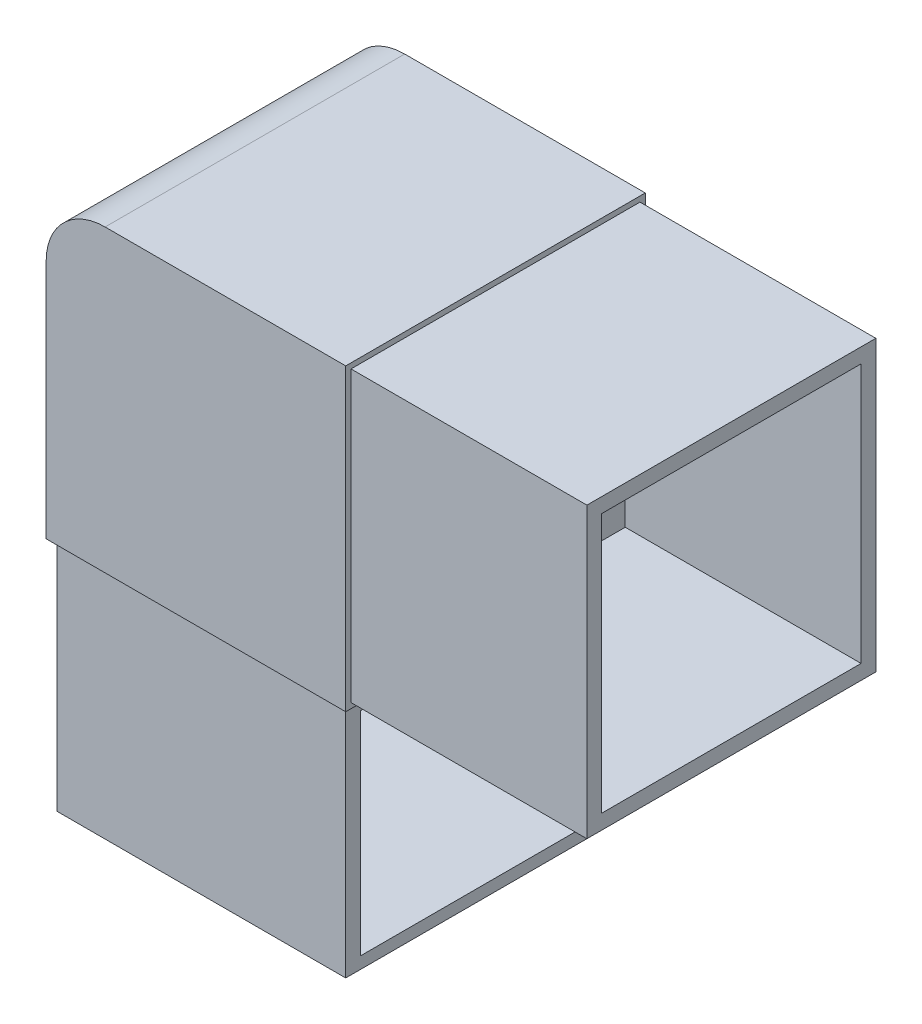
ISO-10303-21;
HEADER;
FILE_DESCRIPTION(('STEP AP214'),'2;1');
FILE_NAME('part.step','',(''),(''),'','','');
FILE_SCHEMA(('AUTOMOTIVE_DESIGN { 1 0 10303 214 1 1 1 1 }'));
ENDSEC;
DATA;
#1=APPLICATION_CONTEXT('core data for automotive mechanical design processes');
#2=APPLICATION_PROTOCOL_DEFINITION('international standard','automotive_design',2000,#1);
#3=PRODUCT_CONTEXT('',#1,'mechanical');
#4=PRODUCT('Part','Part','',(#3));
#5=PRODUCT_RELATED_PRODUCT_CATEGORY('part','',(#4));
#6=PRODUCT_DEFINITION_FORMATION('','',#4);
#7=PRODUCT_DEFINITION_CONTEXT('part definition',#1,'design');
#8=PRODUCT_DEFINITION('design','',#6,#7);
#9=PRODUCT_DEFINITION_SHAPE('','',#8);
#10=(LENGTH_UNIT() NAMED_UNIT(*) SI_UNIT(.MILLI.,.METRE.));
#11=(NAMED_UNIT(*) PLANE_ANGLE_UNIT() SI_UNIT($,.RADIAN.));
#12=(NAMED_UNIT(*) SI_UNIT($,.STERADIAN.) SOLID_ANGLE_UNIT());
#13=UNCERTAINTY_MEASURE_WITH_UNIT(LENGTH_MEASURE(1.E-05),#10,'distance_accuracy_value','');
#14=(GEOMETRIC_REPRESENTATION_CONTEXT(3) GLOBAL_UNCERTAINTY_ASSIGNED_CONTEXT((#13)) GLOBAL_UNIT_ASSIGNED_CONTEXT((#10,
#11,#12)) REPRESENTATION_CONTEXT('',''));
#15=CARTESIAN_POINT('',(0.,0.,0.));
#16=DIRECTION('',(0.,0.,1.));
#17=DIRECTION('',(1.,0.,0.));
#18=AXIS2_PLACEMENT_3D('',#15,#16,#17);
#19=CARTESIAN_POINT('',(0.,0.,0.));
#20=DIRECTION('',(0.,1.,0.));
#21=DIRECTION('',(0.,0.,1.));
#22=AXIS2_PLACEMENT_3D('',#19,#20,#21);
#23=PLANE('',#22);
#24=DIRECTION('',(0.,0.,-1.));
#25=VECTOR('',#24,1.);
#26=CARTESIAN_POINT('',(12.7,0.,-12.7));
#27=LINE('',#26,#25);
#28=CARTESIAN_POINT('',(12.7,0.,12.7));
#29=VERTEX_POINT('',#28);
#30=CARTESIAN_POINT('',(12.7,0.,-12.7));
#31=VERTEX_POINT('',#30);
#32=EDGE_CURVE('E365',#29,#31,#27,.T.);
#33=ORIENTED_EDGE('',*,*,#32,.F.);
#34=DIRECTION('',(1.,0.,0.));
#35=VECTOR('',#34,1.);
#36=CARTESIAN_POINT('',(-12.7,0.,12.7));
#37=LINE('',#36,#35);
#38=CARTESIAN_POINT('',(-12.7,0.,12.7));
#39=VERTEX_POINT('',#38);
#40=EDGE_CURVE('E371',#39,#29,#37,.T.);
#41=ORIENTED_EDGE('',*,*,#40,.F.);
#42=DIRECTION('',(0.,0.,1.));
#43=VECTOR('',#42,1.);
#44=CARTESIAN_POINT('',(-12.7,0.,-12.7));
#45=LINE('',#44,#43);
#46=CARTESIAN_POINT('',(-12.7,0.,-12.7));
#47=VERTEX_POINT('',#46);
#48=EDGE_CURVE('E386',#47,#39,#45,.T.);
#49=ORIENTED_EDGE('',*,*,#48,.F.);
#50=DIRECTION('',(-1.,0.,0.));
#51=VECTOR('',#50,1.);
#52=CARTESIAN_POINT('',(-12.7,0.,-12.7));
#53=LINE('',#52,#51);
#54=EDGE_CURVE('E382',#31,#47,#53,.T.);
#55=ORIENTED_EDGE('',*,*,#54,.F.);
#56=EDGE_LOOP('',(#33,#41,#49,#55));
#57=FACE_BOUND('',#56,.T.);
#58=DIRECTION('',(0.,0.,1.));
#59=VECTOR('',#58,1.);
#60=CARTESIAN_POINT('',(12.25,0.,12.25));
#61=LINE('',#60,#59);
#62=CARTESIAN_POINT('',(12.25,0.,-12.25));
#63=VERTEX_POINT('',#62);
#64=CARTESIAN_POINT('',(12.25,0.,12.25));
#65=VERTEX_POINT('',#64);
#66=EDGE_CURVE('E67',#63,#65,#61,.T.);
#67=ORIENTED_EDGE('',*,*,#66,.F.);
#68=DIRECTION('',(1.,0.,0.));
#69=VECTOR('',#68,1.);
#70=CARTESIAN_POINT('',(-12.25,0.,-12.25));
#71=LINE('',#70,#69);
#72=CARTESIAN_POINT('',(-12.25,0.,-12.25));
#73=VERTEX_POINT('',#72);
#74=EDGE_CURVE('E241',#73,#63,#71,.T.);
#75=ORIENTED_EDGE('',*,*,#74,.F.);
#76=DIRECTION('',(0.,0.,-1.));
#77=VECTOR('',#76,1.);
#78=CARTESIAN_POINT('',(-12.25,0.,12.25));
#79=LINE('',#78,#77);
#80=CARTESIAN_POINT('',(-12.25,0.,12.25));
#81=VERTEX_POINT('',#80);
#82=EDGE_CURVE('E257',#81,#73,#79,.T.);
#83=ORIENTED_EDGE('',*,*,#82,.F.);
#84=DIRECTION('',(-1.,0.,0.));
#85=VECTOR('',#84,1.);
#86=CARTESIAN_POINT('',(-12.25,0.,12.25));
#87=LINE('',#86,#85);
#88=EDGE_CURVE('E253',#65,#81,#87,.T.);
#89=ORIENTED_EDGE('',*,*,#88,.F.);
#90=EDGE_LOOP('',(#67,#75,#83,#89));
#91=FACE_BOUND('',#90,.T.);
#92=ADVANCED_FACE('F43',(#57,#91),#23,.F.);
#93=CARTESIAN_POINT('',(12.7,25.4,-12.7));
#94=DIRECTION('',(-1.,0.,0.));
#95=DIRECTION('',(0.,0.,1.));
#96=AXIS2_PLACEMENT_3D('',#93,#94,#95);
#97=PLANE('',#96);
#98=DIRECTION('',(0.,0.,-1.));
#99=VECTOR('',#98,1.);
#100=CARTESIAN_POINT('',(12.7,24.95,0.));
#101=LINE('',#100,#99);
#102=CARTESIAN_POINT('',(12.7,24.95,12.25));
#103=VERTEX_POINT('',#102);
#104=CARTESIAN_POINT('',(12.7,24.95,-12.25));
#105=VERTEX_POINT('',#104);
#106=EDGE_CURVE('E342',#103,#105,#101,.T.);
#107=ORIENTED_EDGE('',*,*,#106,.T.);
#108=DIRECTION('',(0.,-1.,0.));
#109=VECTOR('',#108,1.);
#110=CARTESIAN_POINT('',(12.7,0.,-12.25));
#111=LINE('',#110,#109);
#112=CARTESIAN_POINT('',(12.7,0.449999999999997,-12.25));
#113=VERTEX_POINT('',#112);
#114=EDGE_CURVE('E313',#105,#113,#111,.T.);
#115=ORIENTED_EDGE('',*,*,#114,.T.);
#116=DIRECTION('',(0.,0.,-1.));
#117=VECTOR('',#116,1.);
#118=CARTESIAN_POINT('',(12.7,0.449999999999997,0.));
#119=LINE('',#118,#117);
#120=CARTESIAN_POINT('',(12.7,0.449999999999997,12.25));
#121=VERTEX_POINT('',#120);
#122=EDGE_CURVE('E328',#121,#113,#119,.T.);
#123=ORIENTED_EDGE('',*,*,#122,.F.);
#124=DIRECTION('',(0.,-1.,0.));
#125=VECTOR('',#124,1.);
#126=CARTESIAN_POINT('',(12.7,0.,12.25));
#127=LINE('',#126,#125);
#128=EDGE_CURVE('E346',#103,#121,#127,.T.);
#129=ORIENTED_EDGE('',*,*,#128,.F.);
#130=EDGE_LOOP('',(#107,#115,#123,#129));
#131=FACE_BOUND('',#130,.T.);
#132=ORIENTED_EDGE('',*,*,#32,.T.);
#133=DIRECTION('',(0.,-1.,0.));
#134=VECTOR('',#133,1.);
#135=CARTESIAN_POINT('',(12.7,25.4,-12.7));
#136=LINE('',#135,#134);
#137=CARTESIAN_POINT('',(12.7,25.4,-12.7));
#138=VERTEX_POINT('',#137);
#139=EDGE_CURVE('E401',#138,#31,#136,.T.);
#140=ORIENTED_EDGE('',*,*,#139,.F.);
#141=DIRECTION('',(0.,0.,-1.));
#142=VECTOR('',#141,1.);
#143=CARTESIAN_POINT('',(12.7,25.4,-12.7));
#144=LINE('',#143,#142);
#145=CARTESIAN_POINT('',(12.7,25.4,12.7));
#146=VERTEX_POINT('',#145);
#147=EDGE_CURVE('E366',#146,#138,#144,.T.);
#148=ORIENTED_EDGE('',*,*,#147,.F.);
#149=DIRECTION('',(0.,-1.,0.));
#150=VECTOR('',#149,1.);
#151=CARTESIAN_POINT('',(12.7,25.4,12.7));
#152=LINE('',#151,#150);
#153=EDGE_CURVE('E378',#146,#29,#152,.T.);
#154=ORIENTED_EDGE('',*,*,#153,.T.);
#155=EDGE_LOOP('',(#132,#140,#148,#154));
#156=FACE_BOUND('',#155,.T.);
#157=ADVANCED_FACE('F434',(#131,#156),#97,.F.);
#158=CARTESIAN_POINT('',(-12.7,25.4,-12.7));
#159=DIRECTION('',(0.,0.,1.));
#160=DIRECTION('',(1.,0.,0.));
#161=AXIS2_PLACEMENT_3D('',#158,#159,#160);
#162=PLANE('',#161);
#163=DIRECTION('',(0.,-1.,0.));
#164=VECTOR('',#163,1.);
#165=CARTESIAN_POINT('',(-12.7,25.4,-12.7));
#166=LINE('',#165,#164);
#167=CARTESIAN_POINT('',(-12.7,20.4,-12.7));
#168=VERTEX_POINT('',#167);
#169=EDGE_CURVE('E398',#168,#47,#166,.T.);
#170=ORIENTED_EDGE('',*,*,#169,.F.);
#171=CARTESIAN_POINT('',(-7.7,20.4,-12.7));
#172=DIRECTION('',(0.,0.,1.));
#173=DIRECTION('',(1.,0.,0.));
#174=AXIS2_PLACEMENT_3D('',#171,#172,#173);
#175=CIRCLE('',#174,5.);
#176=CARTESIAN_POINT('',(-7.7,25.4,-12.7));
#177=VERTEX_POINT('',#176);
#178=EDGE_CURVE('E11',#168,#177,#175,.F.);
#179=ORIENTED_EDGE('',*,*,#178,.T.);
#180=DIRECTION('',(-1.,0.,0.));
#181=VECTOR('',#180,1.);
#182=CARTESIAN_POINT('',(-12.7,25.4,-12.7));
#183=LINE('',#182,#181);
#184=EDGE_CURVE('E370',#138,#177,#183,.T.);
#185=ORIENTED_EDGE('',*,*,#184,.F.);
#186=ORIENTED_EDGE('',*,*,#139,.T.);
#187=ORIENTED_EDGE('',*,*,#54,.T.);
#188=EDGE_LOOP('',(#170,#179,#185,#186,#187));
#189=FACE_BOUND('',#188,.T.);
#190=ADVANCED_FACE('F420',(#189),#162,.F.);
#191=CARTESIAN_POINT('',(-12.7,25.4,-12.7));
#192=DIRECTION('',(1.,0.,0.));
#193=DIRECTION('',(0.,0.,-1.));
#194=AXIS2_PLACEMENT_3D('',#191,#192,#193);
#195=PLANE('',#194);
#196=DIRECTION('',(0.,-1.,0.));
#197=VECTOR('',#196,1.);
#198=CARTESIAN_POINT('',(-12.7,25.4,12.7));
#199=LINE('',#198,#197);
#200=CARTESIAN_POINT('',(-12.7,20.4,12.7));
#201=VERTEX_POINT('',#200);
#202=EDGE_CURVE('E395',#201,#39,#199,.T.);
#203=ORIENTED_EDGE('',*,*,#202,.F.);
#204=DIRECTION('',(0.,0.,1.));
#205=VECTOR('',#204,1.);
#206=CARTESIAN_POINT('',(-12.7,20.4,-12.7));
#207=LINE('',#206,#205);
#208=EDGE_CURVE('E52',#201,#168,#207,.F.);
#209=ORIENTED_EDGE('',*,*,#208,.T.);
#210=ORIENTED_EDGE('',*,*,#169,.T.);
#211=ORIENTED_EDGE('',*,*,#48,.T.);
#212=EDGE_LOOP('',(#203,#209,#210,#211));
#213=FACE_BOUND('',#212,.T.);
#214=ADVANCED_FACE('F416',(#213),#195,.F.);
#215=CARTESIAN_POINT('',(-12.7,25.4,12.7));
#216=DIRECTION('',(0.,0.,-1.));
#217=DIRECTION('',(-1.,0.,0.));
#218=AXIS2_PLACEMENT_3D('',#215,#216,#217);
#219=PLANE('',#218);
#220=DIRECTION('',(1.,0.,0.));
#221=VECTOR('',#220,1.);
#222=CARTESIAN_POINT('',(-12.7,25.4,12.7));
#223=LINE('',#222,#221);
#224=CARTESIAN_POINT('',(-7.7,25.4,12.7));
#225=VERTEX_POINT('',#224);
#226=EDGE_CURVE('E375',#225,#146,#223,.T.);
#227=ORIENTED_EDGE('',*,*,#226,.F.);
#228=CARTESIAN_POINT('',(-7.7,20.4,12.7));
#229=DIRECTION('',(0.,0.,-1.));
#230=DIRECTION('',(-1.,0.,0.));
#231=AXIS2_PLACEMENT_3D('',#228,#229,#230);
#232=CIRCLE('',#231,5.);
#233=EDGE_CURVE('E409',#225,#201,#232,.F.);
#234=ORIENTED_EDGE('',*,*,#233,.T.);
#235=ORIENTED_EDGE('',*,*,#202,.T.);
#236=ORIENTED_EDGE('',*,*,#40,.T.);
#237=ORIENTED_EDGE('',*,*,#153,.F.);
#238=EDGE_LOOP('',(#227,#234,#235,#236,#237));
#239=FACE_BOUND('',#238,.T.);
#240=ADVANCED_FACE('F428',(#239),#219,.F.);
#241=CARTESIAN_POINT('',(0.,25.4,0.));
#242=DIRECTION('',(0.,1.,0.));
#243=DIRECTION('',(0.,0.,1.));
#244=AXIS2_PLACEMENT_3D('',#241,#242,#243);
#245=PLANE('',#244);
#246=ORIENTED_EDGE('',*,*,#184,.T.);
#247=DIRECTION('',(0.,0.,1.));
#248=VECTOR('',#247,1.);
#249=CARTESIAN_POINT('',(-7.7,25.4,12.7));
#250=LINE('',#249,#248);
#251=EDGE_CURVE('E405',#177,#225,#250,.T.);
#252=ORIENTED_EDGE('',*,*,#251,.T.);
#253=ORIENTED_EDGE('',*,*,#226,.T.);
#254=ORIENTED_EDGE('',*,*,#147,.T.);
#255=EDGE_LOOP('',(#246,#252,#253,#254));
#256=FACE_BOUND('',#255,.T.);
#257=ADVANCED_FACE('F425',(#256),#245,.T.);
#258=CARTESIAN_POINT('',(-7.7,20.4,0.));
#259=DIRECTION('',(0.,0.,-1.));
#260=DIRECTION('',(-1.,0.,0.));
#261=AXIS2_PLACEMENT_3D('',#258,#259,#260);
#262=CYLINDRICAL_SURFACE('',#261,5.);
#263=ORIENTED_EDGE('',*,*,#178,.F.);
#264=ORIENTED_EDGE('',*,*,#208,.F.);
#265=ORIENTED_EDGE('',*,*,#233,.F.);
#266=ORIENTED_EDGE('',*,*,#251,.F.);
#267=EDGE_LOOP('',(#263,#264,#265,#266));
#268=FACE_BOUND('',#267,.T.);
#269=ADVANCED_FACE('F45',(#268),#262,.T.);
#270=CARTESIAN_POINT('',(32.7,0.,-12.25));
#271=DIRECTION('',(0.,0.,-1.));
#272=DIRECTION('',(0.,1.,0.));
#273=AXIS2_PLACEMENT_3D('',#270,#271,#272);
#274=PLANE('',#273);
#275=ORIENTED_EDGE('',*,*,#114,.F.);
#276=DIRECTION('',(-1.,0.,0.));
#277=VECTOR('',#276,1.);
#278=CARTESIAN_POINT('',(32.7,24.95,-12.25));
#279=LINE('',#278,#277);
#280=CARTESIAN_POINT('',(32.7,24.95,-12.25));
#281=VERTEX_POINT('',#280);
#282=EDGE_CURVE('E361',#281,#105,#279,.T.);
#283=ORIENTED_EDGE('',*,*,#282,.F.);
#284=DIRECTION('',(0.,-1.,0.));
#285=VECTOR('',#284,1.);
#286=CARTESIAN_POINT('',(32.7,0.,-12.25));
#287=LINE('',#286,#285);
#288=CARTESIAN_POINT('',(32.7,0.449999999999997,-12.25));
#289=VERTEX_POINT('',#288);
#290=EDGE_CURVE('E323',#281,#289,#287,.T.);
#291=ORIENTED_EDGE('',*,*,#290,.T.);
#292=DIRECTION('',(-1.,0.,0.));
#293=VECTOR('',#292,1.);
#294=CARTESIAN_POINT('',(32.7,0.449999999999997,-12.25));
#295=LINE('',#294,#293);
#296=EDGE_CURVE('E338',#289,#113,#295,.T.);
#297=ORIENTED_EDGE('',*,*,#296,.T.);
#298=EDGE_LOOP('',(#275,#283,#291,#297));
#299=FACE_BOUND('',#298,.T.);
#300=ADVANCED_FACE('F473',(#299),#274,.T.);
#301=CARTESIAN_POINT('',(32.7,24.95,0.));
#302=DIRECTION('',(0.,1.,0.));
#303=DIRECTION('',(0.,0.,1.));
#304=AXIS2_PLACEMENT_3D('',#301,#302,#303);
#305=PLANE('',#304);
#306=ORIENTED_EDGE('',*,*,#106,.F.);
#307=DIRECTION('',(-1.,0.,0.));
#308=VECTOR('',#307,1.);
#309=CARTESIAN_POINT('',(32.7,24.95,12.25));
#310=LINE('',#309,#308);
#311=CARTESIAN_POINT('',(32.7,24.95,12.25));
#312=VERTEX_POINT('',#311);
#313=EDGE_CURVE('E358',#312,#103,#310,.T.);
#314=ORIENTED_EDGE('',*,*,#313,.F.);
#315=DIRECTION('',(0.,0.,-1.));
#316=VECTOR('',#315,1.);
#317=CARTESIAN_POINT('',(32.7,24.95,0.));
#318=LINE('',#317,#316);
#319=EDGE_CURVE('E327',#312,#281,#318,.T.);
#320=ORIENTED_EDGE('',*,*,#319,.T.);
#321=ORIENTED_EDGE('',*,*,#282,.T.);
#322=EDGE_LOOP('',(#306,#314,#320,#321));
#323=FACE_BOUND('',#322,.T.);
#324=ADVANCED_FACE('F479',(#323),#305,.T.);
#325=CARTESIAN_POINT('',(32.7,0.,12.25));
#326=DIRECTION('',(0.,0.,-1.));
#327=DIRECTION('',(0.,1.,0.));
#328=AXIS2_PLACEMENT_3D('',#325,#326,#327);
#329=PLANE('',#328);
#330=ORIENTED_EDGE('',*,*,#128,.T.);
#331=DIRECTION('',(-1.,0.,0.));
#332=VECTOR('',#331,1.);
#333=CARTESIAN_POINT('',(32.7,0.449999999999997,12.25));
#334=LINE('',#333,#332);
#335=CARTESIAN_POINT('',(32.7,0.449999999999997,12.25));
#336=VERTEX_POINT('',#335);
#337=EDGE_CURVE('E354',#336,#121,#334,.T.);
#338=ORIENTED_EDGE('',*,*,#337,.F.);
#339=DIRECTION('',(0.,-1.,0.));
#340=VECTOR('',#339,1.);
#341=CARTESIAN_POINT('',(32.7,0.,12.25));
#342=LINE('',#341,#340);
#343=EDGE_CURVE('E332',#312,#336,#342,.T.);
#344=ORIENTED_EDGE('',*,*,#343,.F.);
#345=ORIENTED_EDGE('',*,*,#313,.T.);
#346=EDGE_LOOP('',(#330,#338,#344,#345));
#347=FACE_BOUND('',#346,.T.);
#348=ADVANCED_FACE('F486',(#347),#329,.F.);
#349=CARTESIAN_POINT('',(32.7,0.449999999999997,0.));
#350=DIRECTION('',(0.,1.,0.));
#351=DIRECTION('',(0.,0.,1.));
#352=AXIS2_PLACEMENT_3D('',#349,#350,#351);
#353=PLANE('',#352);
#354=ORIENTED_EDGE('',*,*,#122,.T.);
#355=ORIENTED_EDGE('',*,*,#296,.F.);
#356=DIRECTION('',(0.,0.,-1.));
#357=VECTOR('',#356,1.);
#358=CARTESIAN_POINT('',(32.7,0.449999999999997,0.));
#359=LINE('',#358,#357);
#360=EDGE_CURVE('E335',#336,#289,#359,.T.);
#361=ORIENTED_EDGE('',*,*,#360,.F.);
#362=ORIENTED_EDGE('',*,*,#337,.T.);
#363=EDGE_LOOP('',(#354,#355,#361,#362));
#364=FACE_BOUND('',#363,.T.);
#365=ADVANCED_FACE('F494',(#364),#353,.F.);
#366=CARTESIAN_POINT('',(32.7,0.,0.));
#367=DIRECTION('',(1.,0.,0.));
#368=DIRECTION('',(0.,0.,-1.));
#369=AXIS2_PLACEMENT_3D('',#366,#367,#368);
#370=PLANE('',#369);
#371=DIRECTION('',(0.,1.,0.));
#372=VECTOR('',#371,1.);
#373=CARTESIAN_POINT('',(32.7,23.7,-11.));
#374=LINE('',#373,#372);
#375=CARTESIAN_POINT('',(32.7,1.7,-11.));
#376=VERTEX_POINT('',#375);
#377=CARTESIAN_POINT('',(32.7,23.7,-11.));
#378=VERTEX_POINT('',#377);
#379=EDGE_CURVE('E278',#376,#378,#374,.T.);
#380=ORIENTED_EDGE('',*,*,#379,.F.);
#381=DIRECTION('',(0.,0.,-1.));
#382=VECTOR('',#381,1.);
#383=CARTESIAN_POINT('',(32.7,1.7,11.));
#384=LINE('',#383,#382);
#385=CARTESIAN_POINT('',(32.7,1.7,11.));
#386=VERTEX_POINT('',#385);
#387=EDGE_CURVE('E284',#386,#376,#384,.T.);
#388=ORIENTED_EDGE('',*,*,#387,.F.);
#389=DIRECTION('',(0.,-1.,0.));
#390=VECTOR('',#389,1.);
#391=CARTESIAN_POINT('',(32.7,23.7,11.));
#392=LINE('',#391,#390);
#393=CARTESIAN_POINT('',(32.7,23.7,11.));
#394=VERTEX_POINT('',#393);
#395=EDGE_CURVE('E303',#394,#386,#392,.T.);
#396=ORIENTED_EDGE('',*,*,#395,.F.);
#397=DIRECTION('',(0.,0.,1.));
#398=VECTOR('',#397,1.);
#399=CARTESIAN_POINT('',(32.7,23.7,11.));
#400=LINE('',#399,#398);
#401=EDGE_CURVE('E299',#378,#394,#400,.T.);
#402=ORIENTED_EDGE('',*,*,#401,.F.);
#403=EDGE_LOOP('',(#380,#388,#396,#402));
#404=FACE_BOUND('',#403,.T.);
#405=ORIENTED_EDGE('',*,*,#290,.F.);
#406=ORIENTED_EDGE('',*,*,#319,.F.);
#407=ORIENTED_EDGE('',*,*,#343,.T.);
#408=ORIENTED_EDGE('',*,*,#360,.T.);
#409=EDGE_LOOP('',(#405,#406,#407,#408));
#410=FACE_BOUND('',#409,.T.);
#411=ADVANCED_FACE('F502',(#404,#410),#370,.T.);
#412=CARTESIAN_POINT('',(12.7,23.7,-11.));
#413=DIRECTION('',(0.,0.,-1.));
#414=DIRECTION('',(0.,1.,0.));
#415=AXIS2_PLACEMENT_3D('',#412,#413,#414);
#416=PLANE('',#415);
#417=ORIENTED_EDGE('',*,*,#379,.T.);
#418=DIRECTION('',(1.,0.,0.));
#419=VECTOR('',#418,1.);
#420=CARTESIAN_POINT('',(12.7,23.7,-11.));
#421=LINE('',#420,#419);
#422=CARTESIAN_POINT('',(12.7,23.7,-11.));
#423=VERTEX_POINT('',#422);
#424=EDGE_CURVE('E296',#423,#378,#421,.T.);
#425=ORIENTED_EDGE('',*,*,#424,.F.);
#426=DIRECTION('',(0.,1.,0.));
#427=VECTOR('',#426,1.);
#428=CARTESIAN_POINT('',(12.7,23.7,-11.));
#429=LINE('',#428,#427);
#430=CARTESIAN_POINT('',(12.7,1.7,-11.));
#431=VERTEX_POINT('',#430);
#432=EDGE_CURVE('E279',#431,#423,#429,.T.);
#433=ORIENTED_EDGE('',*,*,#432,.F.);
#434=DIRECTION('',(1.,0.,0.));
#435=VECTOR('',#434,1.);
#436=CARTESIAN_POINT('',(12.7,1.7,-11.));
#437=LINE('',#436,#435);
#438=EDGE_CURVE('E310',#431,#376,#437,.T.);
#439=ORIENTED_EDGE('',*,*,#438,.T.);
#440=EDGE_LOOP('',(#417,#425,#433,#439));
#441=FACE_BOUND('',#440,.T.);
#442=ADVANCED_FACE('F510',(#441),#416,.F.);
#443=CARTESIAN_POINT('',(12.7,1.7,11.));
#444=DIRECTION('',(0.,-1.,0.));
#445=DIRECTION('',(0.,0.,-1.));
#446=AXIS2_PLACEMENT_3D('',#443,#444,#445);
#447=PLANE('',#446);
#448=ORIENTED_EDGE('',*,*,#387,.T.);
#449=ORIENTED_EDGE('',*,*,#438,.F.);
#450=DIRECTION('',(0.,0.,-1.));
#451=VECTOR('',#450,1.);
#452=CARTESIAN_POINT('',(12.7,1.7,11.));
#453=LINE('',#452,#451);
#454=CARTESIAN_POINT('',(12.7,1.7,11.));
#455=VERTEX_POINT('',#454);
#456=EDGE_CURVE('E292',#455,#431,#453,.T.);
#457=ORIENTED_EDGE('',*,*,#456,.F.);
#458=DIRECTION('',(1.,0.,0.));
#459=VECTOR('',#458,1.);
#460=CARTESIAN_POINT('',(12.7,1.7,11.));
#461=LINE('',#460,#459);
#462=EDGE_CURVE('E314',#455,#386,#461,.T.);
#463=ORIENTED_EDGE('',*,*,#462,.T.);
#464=EDGE_LOOP('',(#448,#449,#457,#463));
#465=FACE_BOUND('',#464,.T.);
#466=ADVANCED_FACE('F518',(#465),#447,.F.);
#467=CARTESIAN_POINT('',(12.7,23.7,11.));
#468=DIRECTION('',(0.,0.,1.));
#469=DIRECTION('',(0.,-1.,0.));
#470=AXIS2_PLACEMENT_3D('',#467,#468,#469);
#471=PLANE('',#470);
#472=ORIENTED_EDGE('',*,*,#395,.T.);
#473=ORIENTED_EDGE('',*,*,#462,.F.);
#474=DIRECTION('',(0.,-1.,0.));
#475=VECTOR('',#474,1.);
#476=CARTESIAN_POINT('',(12.7,23.7,11.));
#477=LINE('',#476,#475);
#478=CARTESIAN_POINT('',(12.7,23.7,11.));
#479=VERTEX_POINT('',#478);
#480=EDGE_CURVE('E288',#479,#455,#477,.T.);
#481=ORIENTED_EDGE('',*,*,#480,.F.);
#482=DIRECTION('',(1.,0.,0.));
#483=VECTOR('',#482,1.);
#484=CARTESIAN_POINT('',(12.7,23.7,11.));
#485=LINE('',#484,#483);
#486=EDGE_CURVE('E317',#479,#394,#485,.T.);
#487=ORIENTED_EDGE('',*,*,#486,.T.);
#488=EDGE_LOOP('',(#472,#473,#481,#487));
#489=FACE_BOUND('',#488,.T.);
#490=ADVANCED_FACE('F526',(#489),#471,.F.);
#491=CARTESIAN_POINT('',(12.7,23.7,11.));
#492=DIRECTION('',(0.,1.,0.));
#493=DIRECTION('',(0.,0.,1.));
#494=AXIS2_PLACEMENT_3D('',#491,#492,#493);
#495=PLANE('',#494);
#496=ORIENTED_EDGE('',*,*,#401,.T.);
#497=ORIENTED_EDGE('',*,*,#486,.F.);
#498=DIRECTION('',(0.,0.,1.));
#499=VECTOR('',#498,1.);
#500=CARTESIAN_POINT('',(12.7,23.7,11.));
#501=LINE('',#500,#499);
#502=EDGE_CURVE('E283',#423,#479,#501,.T.);
#503=ORIENTED_EDGE('',*,*,#502,.F.);
#504=ORIENTED_EDGE('',*,*,#424,.T.);
#505=EDGE_LOOP('',(#496,#497,#503,#504));
#506=FACE_BOUND('',#505,.T.);
#507=ADVANCED_FACE('F534',(#506),#495,.F.);
#508=CARTESIAN_POINT('',(12.7,0.,0.));
#509=DIRECTION('',(1.,0.,0.));
#510=DIRECTION('',(0.,0.,-1.));
#511=AXIS2_PLACEMENT_3D('',#508,#509,#510);
#512=PLANE('',#511);
#513=ORIENTED_EDGE('',*,*,#432,.T.);
#514=ORIENTED_EDGE('',*,*,#502,.T.);
#515=ORIENTED_EDGE('',*,*,#480,.T.);
#516=ORIENTED_EDGE('',*,*,#456,.T.);
#517=EDGE_LOOP('',(#513,#514,#515,#516));
#518=FACE_BOUND('',#517,.T.);
#519=ADVANCED_FACE('F542',(#518),#512,.T.);
#520=CARTESIAN_POINT('',(12.25,-20.,12.25));
#521=DIRECTION('',(-1.,0.,0.));
#522=DIRECTION('',(0.,0.,1.));
#523=AXIS2_PLACEMENT_3D('',#520,#521,#522);
#524=PLANE('',#523);
#525=DIRECTION('',(0.,0.,1.));
#526=VECTOR('',#525,1.);
#527=CARTESIAN_POINT('',(12.25,-0.999999999999997,11.));
#528=LINE('',#527,#526);
#529=CARTESIAN_POINT('',(12.25,-0.999999999999997,-11.));
#530=VERTEX_POINT('',#529);
#531=CARTESIAN_POINT('',(12.25,-0.999999999999997,11.));
#532=VERTEX_POINT('',#531);
#533=EDGE_CURVE('E222',#530,#532,#528,.T.);
#534=ORIENTED_EDGE('',*,*,#533,.F.);
#535=DIRECTION('',(0.,1.,0.));
#536=VECTOR('',#535,1.);
#537=CARTESIAN_POINT('',(12.25,-0.999999999999997,-11.));
#538=LINE('',#537,#536);
#539=CARTESIAN_POINT('',(12.25,-19.,-11.));
#540=VERTEX_POINT('',#539);
#541=EDGE_CURVE('E59',#540,#530,#538,.T.);
#542=ORIENTED_EDGE('',*,*,#541,.F.);
#543=DIRECTION('',(0.,0.,-1.));
#544=VECTOR('',#543,1.);
#545=CARTESIAN_POINT('',(12.25,-19.,11.));
#546=LINE('',#545,#544);
#547=CARTESIAN_POINT('',(12.25,-19.,11.));
#548=VERTEX_POINT('',#547);
#549=EDGE_CURVE('E209',#548,#540,#546,.T.);
#550=ORIENTED_EDGE('',*,*,#549,.F.);
#551=DIRECTION('',(0.,-1.,0.));
#552=VECTOR('',#551,1.);
#553=CARTESIAN_POINT('',(12.25,-0.999999999999997,11.));
#554=LINE('',#553,#552);
#555=EDGE_CURVE('E213',#532,#548,#554,.T.);
#556=ORIENTED_EDGE('',*,*,#555,.F.);
#557=EDGE_LOOP('',(#534,#542,#550,#556));
#558=FACE_BOUND('',#557,.T.);
#559=ORIENTED_EDGE('',*,*,#66,.T.);
#560=DIRECTION('',(0.,1.,0.));
#561=VECTOR('',#560,1.);
#562=CARTESIAN_POINT('',(12.25,-20.,12.25));
#563=LINE('',#562,#561);
#564=CARTESIAN_POINT('',(12.25,-20.,12.25));
#565=VERTEX_POINT('',#564);
#566=EDGE_CURVE('E274',#565,#65,#563,.T.);
#567=ORIENTED_EDGE('',*,*,#566,.F.);
#568=DIRECTION('',(0.,0.,1.));
#569=VECTOR('',#568,1.);
#570=CARTESIAN_POINT('',(12.25,-20.,12.25));
#571=LINE('',#570,#569);
#572=CARTESIAN_POINT('',(12.25,-20.,-12.25));
#573=VERTEX_POINT('',#572);
#574=EDGE_CURVE('E236',#573,#565,#571,.T.);
#575=ORIENTED_EDGE('',*,*,#574,.F.);
#576=DIRECTION('',(0.,1.,0.));
#577=VECTOR('',#576,1.);
#578=CARTESIAN_POINT('',(12.25,-20.,-12.25));
#579=LINE('',#578,#577);
#580=EDGE_CURVE('E250',#573,#63,#579,.T.);
#581=ORIENTED_EDGE('',*,*,#580,.T.);
#582=EDGE_LOOP('',(#559,#567,#575,#581));
#583=FACE_BOUND('',#582,.T.);
#584=ADVANCED_FACE('F550',(#558,#583),#524,.F.);
#585=CARTESIAN_POINT('',(-12.25,-20.,12.25));
#586=DIRECTION('',(0.,0.,-1.));
#587=DIRECTION('',(-1.,0.,0.));
#588=AXIS2_PLACEMENT_3D('',#585,#586,#587);
#589=PLANE('',#588);
#590=ORIENTED_EDGE('',*,*,#88,.T.);
#591=DIRECTION('',(0.,1.,0.));
#592=VECTOR('',#591,1.);
#593=CARTESIAN_POINT('',(-12.25,-20.,12.25));
#594=LINE('',#593,#592);
#595=CARTESIAN_POINT('',(-12.25,-20.,12.25));
#596=VERTEX_POINT('',#595);
#597=EDGE_CURVE('E270',#596,#81,#594,.T.);
#598=ORIENTED_EDGE('',*,*,#597,.F.);
#599=DIRECTION('',(-1.,0.,0.));
#600=VECTOR('',#599,1.);
#601=CARTESIAN_POINT('',(-12.25,-20.,12.25));
#602=LINE('',#601,#600);
#603=EDGE_CURVE('E240',#565,#596,#602,.T.);
#604=ORIENTED_EDGE('',*,*,#603,.F.);
#605=ORIENTED_EDGE('',*,*,#566,.T.);
#606=EDGE_LOOP('',(#590,#598,#604,#605));
#607=FACE_BOUND('',#606,.T.);
#608=ADVANCED_FACE('F558',(#607),#589,.F.);
#609=CARTESIAN_POINT('',(-12.25,-20.,12.25));
#610=DIRECTION('',(1.,0.,0.));
#611=DIRECTION('',(0.,0.,-1.));
#612=AXIS2_PLACEMENT_3D('',#609,#610,#611);
#613=PLANE('',#612);
#614=ORIENTED_EDGE('',*,*,#82,.T.);
#615=DIRECTION('',(0.,1.,0.));
#616=VECTOR('',#615,1.);
#617=CARTESIAN_POINT('',(-12.25,-20.,-12.25));
#618=LINE('',#617,#616);
#619=CARTESIAN_POINT('',(-12.25,-20.,-12.25));
#620=VERTEX_POINT('',#619);
#621=EDGE_CURVE('E266',#620,#73,#618,.T.);
#622=ORIENTED_EDGE('',*,*,#621,.F.);
#623=DIRECTION('',(0.,0.,-1.));
#624=VECTOR('',#623,1.);
#625=CARTESIAN_POINT('',(-12.25,-20.,12.25));
#626=LINE('',#625,#624);
#627=EDGE_CURVE('E244',#596,#620,#626,.T.);
#628=ORIENTED_EDGE('',*,*,#627,.F.);
#629=ORIENTED_EDGE('',*,*,#597,.T.);
#630=EDGE_LOOP('',(#614,#622,#628,#629));
#631=FACE_BOUND('',#630,.T.);
#632=ADVANCED_FACE('F568',(#631),#613,.F.);
#633=CARTESIAN_POINT('',(-12.25,-20.,-12.25));
#634=DIRECTION('',(0.,0.,1.));
#635=DIRECTION('',(1.,0.,0.));
#636=AXIS2_PLACEMENT_3D('',#633,#634,#635);
#637=PLANE('',#636);
#638=ORIENTED_EDGE('',*,*,#74,.T.);
#639=ORIENTED_EDGE('',*,*,#580,.F.);
#640=DIRECTION('',(1.,0.,0.));
#641=VECTOR('',#640,1.);
#642=CARTESIAN_POINT('',(-12.25,-20.,-12.25));
#643=LINE('',#642,#641);
#644=EDGE_CURVE('E247',#620,#573,#643,.T.);
#645=ORIENTED_EDGE('',*,*,#644,.F.);
#646=ORIENTED_EDGE('',*,*,#621,.T.);
#647=EDGE_LOOP('',(#638,#639,#645,#646));
#648=FACE_BOUND('',#647,.T.);
#649=ADVANCED_FACE('F576',(#648),#637,.F.);
#650=CARTESIAN_POINT('',(0.,-20.,0.));
#651=DIRECTION('',(0.,-1.,0.));
#652=DIRECTION('',(0.,0.,-1.));
#653=AXIS2_PLACEMENT_3D('',#650,#651,#652);
#654=PLANE('',#653);
#655=ORIENTED_EDGE('',*,*,#574,.T.);
#656=ORIENTED_EDGE('',*,*,#603,.T.);
#657=ORIENTED_EDGE('',*,*,#627,.T.);
#658=ORIENTED_EDGE('',*,*,#644,.T.);
#659=EDGE_LOOP('',(#655,#656,#657,#658));
#660=FACE_BOUND('',#659,.T.);
#661=ADVANCED_FACE('F584',(#660),#654,.T.);
#662=CARTESIAN_POINT('',(-10.75,-0.999999999999997,-11.));
#663=DIRECTION('',(0.,0.,-1.));
#664=DIRECTION('',(0.,1.,0.));
#665=AXIS2_PLACEMENT_3D('',#662,#663,#664);
#666=PLANE('',#665);
#667=ORIENTED_EDGE('',*,*,#541,.T.);
#668=DIRECTION('',(1.,0.,0.));
#669=VECTOR('',#668,1.);
#670=CARTESIAN_POINT('',(-10.75,-0.999999999999997,-11.));
#671=LINE('',#670,#669);
#672=CARTESIAN_POINT('',(-10.75,-0.999999999999997,-11.));
#673=VERTEX_POINT('',#672);
#674=EDGE_CURVE('E184',#673,#530,#671,.T.);
#675=ORIENTED_EDGE('',*,*,#674,.F.);
#676=DIRECTION('',(0.,1.,0.));
#677=VECTOR('',#676,1.);
#678=CARTESIAN_POINT('',(-10.75,-0.999999999999997,-11.));
#679=LINE('',#678,#677);
#680=CARTESIAN_POINT('',(-10.75,-19.,-11.));
#681=VERTEX_POINT('',#680);
#682=EDGE_CURVE('E188',#681,#673,#679,.T.);
#683=ORIENTED_EDGE('',*,*,#682,.F.);
#684=DIRECTION('',(1.,0.,0.));
#685=VECTOR('',#684,1.);
#686=CARTESIAN_POINT('',(-10.75,-19.,-11.));
#687=LINE('',#686,#685);
#688=EDGE_CURVE('E228',#681,#540,#687,.T.);
#689=ORIENTED_EDGE('',*,*,#688,.T.);
#690=EDGE_LOOP('',(#667,#675,#683,#689));
#691=FACE_BOUND('',#690,.T.);
#692=ADVANCED_FACE('F186',(#691),#666,.F.);
#693=CARTESIAN_POINT('',(-10.75,-19.,11.));
#694=DIRECTION('',(0.,-1.,0.));
#695=DIRECTION('',(0.,0.,-1.));
#696=AXIS2_PLACEMENT_3D('',#693,#694,#695);
#697=PLANE('',#696);
#698=ORIENTED_EDGE('',*,*,#549,.T.);
#699=ORIENTED_EDGE('',*,*,#688,.F.);
#700=DIRECTION('',(0.,0.,-1.));
#701=VECTOR('',#700,1.);
#702=CARTESIAN_POINT('',(-10.75,-19.,11.));
#703=LINE('',#702,#701);
#704=CARTESIAN_POINT('',(-10.75,-19.,11.));
#705=VERTEX_POINT('',#704);
#706=EDGE_CURVE('E195',#705,#681,#703,.T.);
#707=ORIENTED_EDGE('',*,*,#706,.F.);
#708=DIRECTION('',(1.,0.,0.));
#709=VECTOR('',#708,1.);
#710=CARTESIAN_POINT('',(-10.75,-19.,11.));
#711=LINE('',#710,#709);
#712=EDGE_CURVE('E231',#705,#548,#711,.T.);
#713=ORIENTED_EDGE('',*,*,#712,.T.);
#714=EDGE_LOOP('',(#698,#699,#707,#713));
#715=FACE_BOUND('',#714,.T.);
#716=ADVANCED_FACE('F597',(#715),#697,.F.);
#717=CARTESIAN_POINT('',(-10.75,-0.999999999999997,11.));
#718=DIRECTION('',(0.,0.,1.));
#719=DIRECTION('',(0.,-1.,0.));
#720=AXIS2_PLACEMENT_3D('',#717,#718,#719);
#721=PLANE('',#720);
#722=ORIENTED_EDGE('',*,*,#555,.T.);
#723=ORIENTED_EDGE('',*,*,#712,.F.);
#724=DIRECTION('',(0.,-1.,0.));
#725=VECTOR('',#724,1.);
#726=CARTESIAN_POINT('',(-10.75,-0.999999999999997,11.));
#727=LINE('',#726,#725);
#728=CARTESIAN_POINT('',(-10.75,-0.999999999999997,11.));
#729=VERTEX_POINT('',#728);
#730=EDGE_CURVE('E204',#729,#705,#727,.T.);
#731=ORIENTED_EDGE('',*,*,#730,.F.);
#732=DIRECTION('',(1.,0.,0.));
#733=VECTOR('',#732,1.);
#734=CARTESIAN_POINT('',(-10.75,-0.999999999999997,11.));
#735=LINE('',#734,#733);
#736=EDGE_CURVE('E194',#729,#532,#735,.T.);
#737=ORIENTED_EDGE('',*,*,#736,.T.);
#738=EDGE_LOOP('',(#722,#723,#731,#737));
#739=FACE_BOUND('',#738,.T.);
#740=ADVANCED_FACE('F604',(#739),#721,.F.);
#741=CARTESIAN_POINT('',(-10.75,-0.999999999999997,11.));
#742=DIRECTION('',(0.,1.,0.));
#743=DIRECTION('',(0.,0.,1.));
#744=AXIS2_PLACEMENT_3D('',#741,#742,#743);
#745=PLANE('',#744);
#746=ORIENTED_EDGE('',*,*,#533,.T.);
#747=ORIENTED_EDGE('',*,*,#736,.F.);
#748=DIRECTION('',(0.,0.,1.));
#749=VECTOR('',#748,1.);
#750=CARTESIAN_POINT('',(-10.75,-0.999999999999997,11.));
#751=LINE('',#750,#749);
#752=EDGE_CURVE('E198',#673,#729,#751,.T.);
#753=ORIENTED_EDGE('',*,*,#752,.F.);
#754=ORIENTED_EDGE('',*,*,#674,.T.);
#755=EDGE_LOOP('',(#746,#747,#753,#754));
#756=FACE_BOUND('',#755,.T.);
#757=ADVANCED_FACE('F199',(#756),#745,.F.);
#758=CARTESIAN_POINT('',(-10.75,0.,0.));
#759=DIRECTION('',(1.,0.,0.));
#760=DIRECTION('',(0.,0.,-1.));
#761=AXIS2_PLACEMENT_3D('',#758,#759,#760);
#762=PLANE('',#761);
#763=ORIENTED_EDGE('',*,*,#682,.T.);
#764=ORIENTED_EDGE('',*,*,#752,.T.);
#765=ORIENTED_EDGE('',*,*,#730,.T.);
#766=ORIENTED_EDGE('',*,*,#706,.T.);
#767=EDGE_LOOP('',(#763,#764,#765,#766));
#768=FACE_BOUND('',#767,.T.);
#769=ADVANCED_FACE('F206',(#768),#762,.T.);
#770=CLOSED_SHELL('',(#92,#157,#190,#214,#240,#257,#269,#300,#324,#348,#365,#411,#442,#466,#490,
#507,#519,#584,#608,#632,#649,#661,#692,#716,#740,#757,#769));
#771=MANIFOLD_SOLID_BREP('B2',#770);
#772=ADVANCED_BREP_SHAPE_REPRESENTATION('',(#18,#771),#14);
#773=SHAPE_DEFINITION_REPRESENTATION(#9,#772);
ENDSEC;
END-ISO-10303-21;
